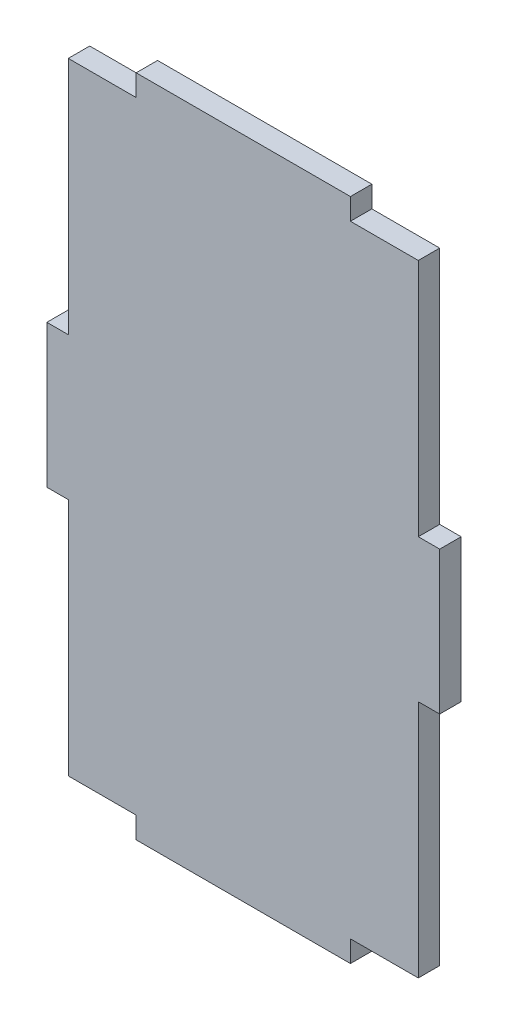
ISO-10303-21;
HEADER;
FILE_DESCRIPTION(('STEP AP214'),'2;1');
FILE_NAME('part.step','',(''),(''),'','','');
FILE_SCHEMA(('AUTOMOTIVE_DESIGN { 1 0 10303 214 1 1 1 1 }'));
ENDSEC;
DATA;
#1=APPLICATION_CONTEXT('core data for automotive mechanical design processes');
#2=APPLICATION_PROTOCOL_DEFINITION('international standard','automotive_design',2000,#1);
#3=PRODUCT_CONTEXT('',#1,'mechanical');
#4=PRODUCT('Part','Part','',(#3));
#5=PRODUCT_RELATED_PRODUCT_CATEGORY('part','',(#4));
#6=PRODUCT_DEFINITION_FORMATION('','',#4);
#7=PRODUCT_DEFINITION_CONTEXT('part definition',#1,'design');
#8=PRODUCT_DEFINITION('design','',#6,#7);
#9=PRODUCT_DEFINITION_SHAPE('','',#8);
#10=(LENGTH_UNIT() NAMED_UNIT(*) SI_UNIT(.MILLI.,.METRE.));
#11=(NAMED_UNIT(*) PLANE_ANGLE_UNIT() SI_UNIT($,.RADIAN.));
#12=(NAMED_UNIT(*) SI_UNIT($,.STERADIAN.) SOLID_ANGLE_UNIT());
#13=UNCERTAINTY_MEASURE_WITH_UNIT(LENGTH_MEASURE(1.E-05),#10,'distance_accuracy_value','');
#14=(GEOMETRIC_REPRESENTATION_CONTEXT(3) GLOBAL_UNCERTAINTY_ASSIGNED_CONTEXT((#13)) GLOBAL_UNIT_ASSIGNED_CONTEXT((#10,
#11,#12)) REPRESENTATION_CONTEXT('',''));
#15=CARTESIAN_POINT('',(0.,0.,0.));
#16=DIRECTION('',(0.,0.,1.));
#17=DIRECTION('',(1.,0.,0.));
#18=AXIS2_PLACEMENT_3D('',#15,#16,#17);
#19=CARTESIAN_POINT('',(27.5,46.5,3.));
#20=DIRECTION('',(-1.,0.,0.));
#21=DIRECTION('',(0.,-1.,0.));
#22=AXIS2_PLACEMENT_3D('',#19,#20,#21);
#23=PLANE('',#22);
#24=DIRECTION('',(0.,1.,0.));
#25=VECTOR('',#24,1.);
#26=CARTESIAN_POINT('',(27.5,46.5,0.));
#27=LINE('',#26,#25);
#28=CARTESIAN_POINT('',(27.5,-10.,0.));
#29=VERTEX_POINT('',#28);
#30=CARTESIAN_POINT('',(27.5,10.,0.));
#31=VERTEX_POINT('',#30);
#32=EDGE_CURVE('E208',#29,#31,#27,.T.);
#33=ORIENTED_EDGE('',*,*,#32,.T.);
#34=DIRECTION('',(0.,0.,1.));
#35=VECTOR('',#34,1.);
#36=CARTESIAN_POINT('',(27.5,10.,0.));
#37=LINE('',#36,#35);
#38=CARTESIAN_POINT('',(27.5,10.,3.));
#39=VERTEX_POINT('',#38);
#40=EDGE_CURVE('E261',#31,#39,#37,.T.);
#41=ORIENTED_EDGE('',*,*,#40,.T.);
#42=DIRECTION('',(0.,1.,0.));
#43=VECTOR('',#42,1.);
#44=CARTESIAN_POINT('',(27.5,46.5,3.));
#45=LINE('',#44,#43);
#46=CARTESIAN_POINT('',(27.5,-10.,3.));
#47=VERTEX_POINT('',#46);
#48=EDGE_CURVE('E196',#47,#39,#45,.T.);
#49=ORIENTED_EDGE('',*,*,#48,.F.);
#50=DIRECTION('',(0.,0.,1.));
#51=VECTOR('',#50,1.);
#52=CARTESIAN_POINT('',(27.5,-10.,0.));
#53=LINE('',#52,#51);
#54=EDGE_CURVE('E284',#29,#47,#53,.T.);
#55=ORIENTED_EDGE('',*,*,#54,.F.);
#56=EDGE_LOOP('',(#33,#41,#49,#55));
#57=FACE_BOUND('',#56,.T.);
#58=ADVANCED_FACE('F32',(#57),#23,.F.);
#59=CARTESIAN_POINT('',(-27.5,46.5,3.));
#60=DIRECTION('',(0.,-1.,0.));
#61=DIRECTION('',(0.,0.,-1.));
#62=AXIS2_PLACEMENT_3D('',#59,#60,#61);
#63=PLANE('',#62);
#64=DIRECTION('',(-1.,0.,0.));
#65=VECTOR('',#64,1.);
#66=CARTESIAN_POINT('',(-27.5,46.5,3.));
#67=LINE('',#66,#65);
#68=CARTESIAN_POINT('',(15.,46.5,3.));
#69=VERTEX_POINT('',#68);
#70=CARTESIAN_POINT('',(-15.,46.5,3.));
#71=VERTEX_POINT('',#70);
#72=EDGE_CURVE('E199',#69,#71,#67,.T.);
#73=ORIENTED_EDGE('',*,*,#72,.F.);
#74=DIRECTION('',(0.,0.,1.));
#75=VECTOR('',#74,1.);
#76=CARTESIAN_POINT('',(15.,46.5,0.));
#77=LINE('',#76,#75);
#78=CARTESIAN_POINT('',(15.,46.5,0.));
#79=VERTEX_POINT('',#78);
#80=EDGE_CURVE('E252',#79,#69,#77,.T.);
#81=ORIENTED_EDGE('',*,*,#80,.F.);
#82=DIRECTION('',(-1.,0.,0.));
#83=VECTOR('',#82,1.);
#84=CARTESIAN_POINT('',(-27.5,46.5,0.));
#85=LINE('',#84,#83);
#86=CARTESIAN_POINT('',(-15.,46.5,0.));
#87=VERTEX_POINT('',#86);
#88=EDGE_CURVE('E202',#79,#87,#85,.T.);
#89=ORIENTED_EDGE('',*,*,#88,.T.);
#90=DIRECTION('',(0.,0.,1.));
#91=VECTOR('',#90,1.);
#92=CARTESIAN_POINT('',(-15.,46.5,0.));
#93=LINE('',#92,#91);
#94=EDGE_CURVE('E212',#87,#71,#93,.T.);
#95=ORIENTED_EDGE('',*,*,#94,.T.);
#96=EDGE_LOOP('',(#73,#81,#89,#95));
#97=FACE_BOUND('',#96,.T.);
#98=ADVANCED_FACE('F365',(#97),#63,.F.);
#99=CARTESIAN_POINT('',(-27.5,46.5,3.));
#100=DIRECTION('',(1.,0.,0.));
#101=DIRECTION('',(0.,1.,0.));
#102=AXIS2_PLACEMENT_3D('',#99,#100,#101);
#103=PLANE('',#102);
#104=DIRECTION('',(0.,-1.,0.));
#105=VECTOR('',#104,1.);
#106=CARTESIAN_POINT('',(-27.5,46.5,0.));
#107=LINE('',#106,#105);
#108=CARTESIAN_POINT('',(-27.5,10.,0.));
#109=VERTEX_POINT('',#108);
#110=CARTESIAN_POINT('',(-27.5,-10.,0.));
#111=VERTEX_POINT('',#110);
#112=EDGE_CURVE('E197',#109,#111,#107,.T.);
#113=ORIENTED_EDGE('',*,*,#112,.T.);
#114=DIRECTION('',(0.,0.,1.));
#115=VECTOR('',#114,1.);
#116=CARTESIAN_POINT('',(-27.5,-10.,0.));
#117=LINE('',#116,#115);
#118=CARTESIAN_POINT('',(-27.5,-10.,3.));
#119=VERTEX_POINT('',#118);
#120=EDGE_CURVE('E241',#111,#119,#117,.T.);
#121=ORIENTED_EDGE('',*,*,#120,.T.);
#122=DIRECTION('',(0.,-1.,0.));
#123=VECTOR('',#122,1.);
#124=CARTESIAN_POINT('',(-27.5,46.5,3.));
#125=LINE('',#124,#123);
#126=CARTESIAN_POINT('',(-27.5,10.,3.));
#127=VERTEX_POINT('',#126);
#128=EDGE_CURVE('E40',#127,#119,#125,.T.);
#129=ORIENTED_EDGE('',*,*,#128,.F.);
#130=DIRECTION('',(0.,0.,1.));
#131=VECTOR('',#130,1.);
#132=CARTESIAN_POINT('',(-27.5,10.,0.));
#133=LINE('',#132,#131);
#134=EDGE_CURVE('E218',#109,#127,#133,.T.);
#135=ORIENTED_EDGE('',*,*,#134,.F.);
#136=EDGE_LOOP('',(#113,#121,#129,#135));
#137=FACE_BOUND('',#136,.T.);
#138=ADVANCED_FACE('F347',(#137),#103,.F.);
#139=CARTESIAN_POINT('',(-27.5,-46.5,3.));
#140=DIRECTION('',(0.,1.,0.));
#141=DIRECTION('',(0.,0.,1.));
#142=AXIS2_PLACEMENT_3D('',#139,#140,#141);
#143=PLANE('',#142);
#144=DIRECTION('',(1.,0.,0.));
#145=VECTOR('',#144,1.);
#146=CARTESIAN_POINT('',(-27.5,-46.5,0.));
#147=LINE('',#146,#145);
#148=CARTESIAN_POINT('',(-15.,-46.5,0.));
#149=VERTEX_POINT('',#148);
#150=CARTESIAN_POINT('',(15.,-46.5,0.));
#151=VERTEX_POINT('',#150);
#152=EDGE_CURVE('E35',#149,#151,#147,.T.);
#153=ORIENTED_EDGE('',*,*,#152,.T.);
#154=DIRECTION('',(0.,0.,1.));
#155=VECTOR('',#154,1.);
#156=CARTESIAN_POINT('',(15.,-46.5,0.));
#157=LINE('',#156,#155);
#158=CARTESIAN_POINT('',(15.,-46.5,3.));
#159=VERTEX_POINT('',#158);
#160=EDGE_CURVE('E292',#151,#159,#157,.T.);
#161=ORIENTED_EDGE('',*,*,#160,.T.);
#162=DIRECTION('',(1.,0.,0.));
#163=VECTOR('',#162,1.);
#164=CARTESIAN_POINT('',(-27.5,-46.5,3.));
#165=LINE('',#164,#163);
#166=CARTESIAN_POINT('',(-15.,-46.5,3.));
#167=VERTEX_POINT('',#166);
#168=EDGE_CURVE('E11',#167,#159,#165,.T.);
#169=ORIENTED_EDGE('',*,*,#168,.F.);
#170=DIRECTION('',(0.,0.,1.));
#171=VECTOR('',#170,1.);
#172=CARTESIAN_POINT('',(-15.,-46.5,0.));
#173=LINE('',#172,#171);
#174=EDGE_CURVE('E174',#149,#167,#173,.T.);
#175=ORIENTED_EDGE('',*,*,#174,.F.);
#176=EDGE_LOOP('',(#153,#161,#169,#175));
#177=FACE_BOUND('',#176,.T.);
#178=ADVANCED_FACE('F186',(#177),#143,.F.);
#179=CARTESIAN_POINT('',(0.,0.,3.));
#180=DIRECTION('',(0.,0.,1.));
#181=DIRECTION('',(1.,0.,0.));
#182=AXIS2_PLACEMENT_3D('',#179,#180,#181);
#183=PLANE('',#182);
#184=DIRECTION('',(1.,0.,0.));
#185=VECTOR('',#184,1.);
#186=CARTESIAN_POINT('',(27.5,10.,3.));
#187=LINE('',#186,#185);
#188=CARTESIAN_POINT('',(24.5,10.,3.));
#189=VERTEX_POINT('',#188);
#190=EDGE_CURVE('E265',#189,#39,#187,.T.);
#191=ORIENTED_EDGE('',*,*,#190,.F.);
#192=DIRECTION('',(0.,-1.,0.));
#193=VECTOR('',#192,1.);
#194=CARTESIAN_POINT('',(24.5,43.5,3.));
#195=LINE('',#194,#193);
#196=CARTESIAN_POINT('',(24.5,43.5,3.));
#197=VERTEX_POINT('',#196);
#198=EDGE_CURVE('E268',#197,#189,#195,.T.);
#199=ORIENTED_EDGE('',*,*,#198,.F.);
#200=DIRECTION('',(1.,0.,0.));
#201=VECTOR('',#200,1.);
#202=CARTESIAN_POINT('',(24.5,43.5,3.));
#203=LINE('',#202,#201);
#204=CARTESIAN_POINT('',(15.,43.5,3.));
#205=VERTEX_POINT('',#204);
#206=EDGE_CURVE('E271',#205,#197,#203,.T.);
#207=ORIENTED_EDGE('',*,*,#206,.F.);
#208=DIRECTION('',(0.,-1.,0.));
#209=VECTOR('',#208,1.);
#210=CARTESIAN_POINT('',(15.,46.5,3.));
#211=LINE('',#210,#209);
#212=EDGE_CURVE('E274',#69,#205,#211,.T.);
#213=ORIENTED_EDGE('',*,*,#212,.F.);
#214=ORIENTED_EDGE('',*,*,#72,.T.);
#215=DIRECTION('',(0.,1.,0.));
#216=VECTOR('',#215,1.);
#217=CARTESIAN_POINT('',(-15.,46.5,3.));
#218=LINE('',#217,#216);
#219=CARTESIAN_POINT('',(-15.,43.5,3.));
#220=VERTEX_POINT('',#219);
#221=EDGE_CURVE('E229',#220,#71,#218,.T.);
#222=ORIENTED_EDGE('',*,*,#221,.F.);
#223=DIRECTION('',(1.,0.,0.));
#224=VECTOR('',#223,1.);
#225=CARTESIAN_POINT('',(-24.5,43.5,3.));
#226=LINE('',#225,#224);
#227=CARTESIAN_POINT('',(-24.5,43.5,3.));
#228=VERTEX_POINT('',#227);
#229=EDGE_CURVE('E232',#228,#220,#226,.T.);
#230=ORIENTED_EDGE('',*,*,#229,.F.);
#231=DIRECTION('',(0.,1.,0.));
#232=VECTOR('',#231,1.);
#233=CARTESIAN_POINT('',(-24.5,43.5,3.));
#234=LINE('',#233,#232);
#235=CARTESIAN_POINT('',(-24.5,10.,3.));
#236=VERTEX_POINT('',#235);
#237=EDGE_CURVE('E235',#236,#228,#234,.T.);
#238=ORIENTED_EDGE('',*,*,#237,.F.);
#239=DIRECTION('',(1.,0.,0.));
#240=VECTOR('',#239,1.);
#241=CARTESIAN_POINT('',(-27.5,10.,3.));
#242=LINE('',#241,#240);
#243=EDGE_CURVE('E238',#127,#236,#242,.T.);
#244=ORIENTED_EDGE('',*,*,#243,.F.);
#245=ORIENTED_EDGE('',*,*,#128,.T.);
#246=DIRECTION('',(-1.,0.,0.));
#247=VECTOR('',#246,1.);
#248=CARTESIAN_POINT('',(-27.5,-10.,3.));
#249=LINE('',#248,#247);
#250=CARTESIAN_POINT('',(-24.5,-10.,3.));
#251=VERTEX_POINT('',#250);
#252=EDGE_CURVE('E181',#251,#119,#249,.T.);
#253=ORIENTED_EDGE('',*,*,#252,.F.);
#254=DIRECTION('',(0.,1.,0.));
#255=VECTOR('',#254,1.);
#256=CARTESIAN_POINT('',(-24.5,-43.5,3.));
#257=LINE('',#256,#255);
#258=CARTESIAN_POINT('',(-24.5,-43.5,3.));
#259=VERTEX_POINT('',#258);
#260=EDGE_CURVE('E319',#259,#251,#257,.T.);
#261=ORIENTED_EDGE('',*,*,#260,.F.);
#262=DIRECTION('',(-1.,0.,0.));
#263=VECTOR('',#262,1.);
#264=CARTESIAN_POINT('',(-24.5,-43.5,3.));
#265=LINE('',#264,#263);
#266=CARTESIAN_POINT('',(-15.,-43.5,3.));
#267=VERTEX_POINT('',#266);
#268=EDGE_CURVE('E322',#267,#259,#265,.T.);
#269=ORIENTED_EDGE('',*,*,#268,.F.);
#270=DIRECTION('',(0.,1.,0.));
#271=VECTOR('',#270,1.);
#272=CARTESIAN_POINT('',(-15.,-46.5,3.));
#273=LINE('',#272,#271);
#274=EDGE_CURVE('E294',#167,#267,#273,.T.);
#275=ORIENTED_EDGE('',*,*,#274,.F.);
#276=ORIENTED_EDGE('',*,*,#168,.T.);
#277=DIRECTION('',(0.,-1.,0.));
#278=VECTOR('',#277,1.);
#279=CARTESIAN_POINT('',(15.,-46.5,3.));
#280=LINE('',#279,#278);
#281=CARTESIAN_POINT('',(15.,-43.5,3.));
#282=VERTEX_POINT('',#281);
#283=EDGE_CURVE('E295',#282,#159,#280,.T.);
#284=ORIENTED_EDGE('',*,*,#283,.F.);
#285=DIRECTION('',(-1.,0.,0.));
#286=VECTOR('',#285,1.);
#287=CARTESIAN_POINT('',(24.5,-43.5,3.));
#288=LINE('',#287,#286);
#289=CARTESIAN_POINT('',(24.5,-43.5,3.));
#290=VERTEX_POINT('',#289);
#291=EDGE_CURVE('E298',#290,#282,#288,.T.);
#292=ORIENTED_EDGE('',*,*,#291,.F.);
#293=DIRECTION('',(0.,-1.,0.));
#294=VECTOR('',#293,1.);
#295=CARTESIAN_POINT('',(24.5,-43.5,3.));
#296=LINE('',#295,#294);
#297=CARTESIAN_POINT('',(24.5,-10.,3.));
#298=VERTEX_POINT('',#297);
#299=EDGE_CURVE('E301',#298,#290,#296,.T.);
#300=ORIENTED_EDGE('',*,*,#299,.F.);
#301=DIRECTION('',(-1.,0.,0.));
#302=VECTOR('',#301,1.);
#303=CARTESIAN_POINT('',(27.5,-10.,3.));
#304=LINE('',#303,#302);
#305=EDGE_CURVE('E264',#47,#298,#304,.T.);
#306=ORIENTED_EDGE('',*,*,#305,.F.);
#307=ORIENTED_EDGE('',*,*,#48,.T.);
#308=EDGE_LOOP('',(#191,#199,#207,#213,#214,#222,#230,#238,#244,#245,#253,#261,#269,#275,#276,
#284,#292,#300,#306,#307));
#309=FACE_BOUND('',#308,.T.);
#310=ADVANCED_FACE('F350',(#309),#183,.T.);
#311=CARTESIAN_POINT('',(0.,0.,0.));
#312=DIRECTION('',(0.,0.,1.));
#313=DIRECTION('',(1.,0.,0.));
#314=AXIS2_PLACEMENT_3D('',#311,#312,#313);
#315=PLANE('',#314);
#316=DIRECTION('',(0.,-1.,0.));
#317=VECTOR('',#316,1.);
#318=CARTESIAN_POINT('',(24.5,43.5,0.));
#319=LINE('',#318,#317);
#320=CARTESIAN_POINT('',(24.5,43.5,0.));
#321=VERTEX_POINT('',#320);
#322=CARTESIAN_POINT('',(24.5,10.,0.));
#323=VERTEX_POINT('',#322);
#324=EDGE_CURVE('E279',#321,#323,#319,.T.);
#325=ORIENTED_EDGE('',*,*,#324,.T.);
#326=DIRECTION('',(1.,0.,0.));
#327=VECTOR('',#326,1.);
#328=CARTESIAN_POINT('',(27.5,10.,0.));
#329=LINE('',#328,#327);
#330=EDGE_CURVE('E255',#323,#31,#329,.T.);
#331=ORIENTED_EDGE('',*,*,#330,.T.);
#332=ORIENTED_EDGE('',*,*,#32,.F.);
#333=DIRECTION('',(-1.,0.,0.));
#334=VECTOR('',#333,1.);
#335=CARTESIAN_POINT('',(27.5,-10.,0.));
#336=LINE('',#335,#334);
#337=CARTESIAN_POINT('',(24.5,-10.,0.));
#338=VERTEX_POINT('',#337);
#339=EDGE_CURVE('E297',#29,#338,#336,.T.);
#340=ORIENTED_EDGE('',*,*,#339,.T.);
#341=DIRECTION('',(0.,-1.,0.));
#342=VECTOR('',#341,1.);
#343=CARTESIAN_POINT('',(24.5,-43.5,0.));
#344=LINE('',#343,#342);
#345=CARTESIAN_POINT('',(24.5,-43.5,0.));
#346=VERTEX_POINT('',#345);
#347=EDGE_CURVE('E56',#338,#346,#344,.T.);
#348=ORIENTED_EDGE('',*,*,#347,.T.);
#349=DIRECTION('',(-1.,0.,0.));
#350=VECTOR('',#349,1.);
#351=CARTESIAN_POINT('',(24.5,-43.5,0.));
#352=LINE('',#351,#350);
#353=CARTESIAN_POINT('',(15.,-43.5,0.));
#354=VERTEX_POINT('',#353);
#355=EDGE_CURVE('E307',#346,#354,#352,.T.);
#356=ORIENTED_EDGE('',*,*,#355,.T.);
#357=DIRECTION('',(0.,-1.,0.));
#358=VECTOR('',#357,1.);
#359=CARTESIAN_POINT('',(15.,-46.5,0.));
#360=LINE('',#359,#358);
#361=EDGE_CURVE('E195',#354,#151,#360,.T.);
#362=ORIENTED_EDGE('',*,*,#361,.T.);
#363=ORIENTED_EDGE('',*,*,#152,.F.);
#364=DIRECTION('',(0.,1.,0.));
#365=VECTOR('',#364,1.);
#366=CARTESIAN_POINT('',(-15.,-46.5,0.));
#367=LINE('',#366,#365);
#368=CARTESIAN_POINT('',(-15.,-43.5,0.));
#369=VERTEX_POINT('',#368);
#370=EDGE_CURVE('E170',#149,#369,#367,.T.);
#371=ORIENTED_EDGE('',*,*,#370,.T.);
#372=DIRECTION('',(-1.,0.,0.));
#373=VECTOR('',#372,1.);
#374=CARTESIAN_POINT('',(-24.5,-43.5,0.));
#375=LINE('',#374,#373);
#376=CARTESIAN_POINT('',(-24.5,-43.5,0.));
#377=VERTEX_POINT('',#376);
#378=EDGE_CURVE('E180',#369,#377,#375,.T.);
#379=ORIENTED_EDGE('',*,*,#378,.T.);
#380=DIRECTION('',(0.,1.,0.));
#381=VECTOR('',#380,1.);
#382=CARTESIAN_POINT('',(-24.5,-43.5,0.));
#383=LINE('',#382,#381);
#384=CARTESIAN_POINT('',(-24.5,-10.,0.));
#385=VERTEX_POINT('',#384);
#386=EDGE_CURVE('E328',#377,#385,#383,.T.);
#387=ORIENTED_EDGE('',*,*,#386,.T.);
#388=DIRECTION('',(-1.,0.,0.));
#389=VECTOR('',#388,1.);
#390=CARTESIAN_POINT('',(-27.5,-10.,0.));
#391=LINE('',#390,#389);
#392=EDGE_CURVE('E188',#385,#111,#391,.T.);
#393=ORIENTED_EDGE('',*,*,#392,.T.);
#394=ORIENTED_EDGE('',*,*,#112,.F.);
#395=DIRECTION('',(1.,0.,0.));
#396=VECTOR('',#395,1.);
#397=CARTESIAN_POINT('',(-27.5,10.,0.));
#398=LINE('',#397,#396);
#399=CARTESIAN_POINT('',(-24.5,10.,0.));
#400=VERTEX_POINT('',#399);
#401=EDGE_CURVE('E231',#109,#400,#398,.T.);
#402=ORIENTED_EDGE('',*,*,#401,.T.);
#403=DIRECTION('',(0.,1.,0.));
#404=VECTOR('',#403,1.);
#405=CARTESIAN_POINT('',(-24.5,43.5,0.));
#406=LINE('',#405,#404);
#407=CARTESIAN_POINT('',(-24.5,43.5,0.));
#408=VERTEX_POINT('',#407);
#409=EDGE_CURVE('E247',#400,#408,#406,.T.);
#410=ORIENTED_EDGE('',*,*,#409,.T.);
#411=DIRECTION('',(1.,0.,0.));
#412=VECTOR('',#411,1.);
#413=CARTESIAN_POINT('',(-24.5,43.5,0.));
#414=LINE('',#413,#412);
#415=CARTESIAN_POINT('',(-15.,43.5,0.));
#416=VERTEX_POINT('',#415);
#417=EDGE_CURVE('E244',#408,#416,#414,.T.);
#418=ORIENTED_EDGE('',*,*,#417,.T.);
#419=DIRECTION('',(0.,1.,0.));
#420=VECTOR('',#419,1.);
#421=CARTESIAN_POINT('',(-15.,46.5,0.));
#422=LINE('',#421,#420);
#423=EDGE_CURVE('E221',#416,#87,#422,.T.);
#424=ORIENTED_EDGE('',*,*,#423,.T.);
#425=ORIENTED_EDGE('',*,*,#88,.F.);
#426=DIRECTION('',(0.,-1.,0.));
#427=VECTOR('',#426,1.);
#428=CARTESIAN_POINT('',(15.,46.5,0.));
#429=LINE('',#428,#427);
#430=CARTESIAN_POINT('',(15.,43.5,0.));
#431=VERTEX_POINT('',#430);
#432=EDGE_CURVE('E267',#79,#431,#429,.T.);
#433=ORIENTED_EDGE('',*,*,#432,.T.);
#434=DIRECTION('',(1.,0.,0.));
#435=VECTOR('',#434,1.);
#436=CARTESIAN_POINT('',(24.5,43.5,0.));
#437=LINE('',#436,#435);
#438=EDGE_CURVE('E48',#431,#321,#437,.T.);
#439=ORIENTED_EDGE('',*,*,#438,.T.);
#440=EDGE_LOOP('',(#325,#331,#332,#340,#348,#356,#362,#363,#371,#379,#387,#393,#394,#402,#410,
#418,#424,#425,#433,#439));
#441=FACE_BOUND('',#440,.T.);
#442=ADVANCED_FACE('F192',(#441),#315,.F.);
#443=CARTESIAN_POINT('',(-15.,46.5,0.));
#444=DIRECTION('',(1.,0.,0.));
#445=DIRECTION('',(0.,0.,-1.));
#446=AXIS2_PLACEMENT_3D('',#443,#444,#445);
#447=PLANE('',#446);
#448=ORIENTED_EDGE('',*,*,#221,.T.);
#449=ORIENTED_EDGE('',*,*,#94,.F.);
#450=ORIENTED_EDGE('',*,*,#423,.F.);
#451=DIRECTION('',(0.,0.,1.));
#452=VECTOR('',#451,1.);
#453=CARTESIAN_POINT('',(-15.,43.5,0.));
#454=LINE('',#453,#452);
#455=EDGE_CURVE('E225',#416,#220,#454,.T.);
#456=ORIENTED_EDGE('',*,*,#455,.T.);
#457=EDGE_LOOP('',(#448,#449,#450,#456));
#458=FACE_BOUND('',#457,.T.);
#459=ADVANCED_FACE('F415',(#458),#447,.F.);
#460=CARTESIAN_POINT('',(-24.5,43.5,0.));
#461=DIRECTION('',(0.,-1.,0.));
#462=DIRECTION('',(0.,0.,-1.));
#463=AXIS2_PLACEMENT_3D('',#460,#461,#462);
#464=PLANE('',#463);
#465=ORIENTED_EDGE('',*,*,#229,.T.);
#466=ORIENTED_EDGE('',*,*,#455,.F.);
#467=ORIENTED_EDGE('',*,*,#417,.F.);
#468=DIRECTION('',(0.,0.,1.));
#469=VECTOR('',#468,1.);
#470=CARTESIAN_POINT('',(-24.5,43.5,0.));
#471=LINE('',#470,#469);
#472=EDGE_CURVE('E223',#408,#228,#471,.T.);
#473=ORIENTED_EDGE('',*,*,#472,.T.);
#474=EDGE_LOOP('',(#465,#466,#467,#473));
#475=FACE_BOUND('',#474,.T.);
#476=ADVANCED_FACE('F358',(#475),#464,.F.);
#477=CARTESIAN_POINT('',(-24.5,43.5,0.));
#478=DIRECTION('',(1.,0.,0.));
#479=DIRECTION('',(0.,1.,0.));
#480=AXIS2_PLACEMENT_3D('',#477,#478,#479);
#481=PLANE('',#480);
#482=ORIENTED_EDGE('',*,*,#237,.T.);
#483=ORIENTED_EDGE('',*,*,#472,.F.);
#484=ORIENTED_EDGE('',*,*,#409,.F.);
#485=DIRECTION('',(0.,0.,1.));
#486=VECTOR('',#485,1.);
#487=CARTESIAN_POINT('',(-24.5,10.,0.));
#488=LINE('',#487,#486);
#489=EDGE_CURVE('E220',#400,#236,#488,.T.);
#490=ORIENTED_EDGE('',*,*,#489,.T.);
#491=EDGE_LOOP('',(#482,#483,#484,#490));
#492=FACE_BOUND('',#491,.T.);
#493=ADVANCED_FACE('F355',(#492),#481,.F.);
#494=CARTESIAN_POINT('',(-27.5,10.,0.));
#495=DIRECTION('',(0.,-1.,0.));
#496=DIRECTION('',(0.,0.,-1.));
#497=AXIS2_PLACEMENT_3D('',#494,#495,#496);
#498=PLANE('',#497);
#499=ORIENTED_EDGE('',*,*,#243,.T.);
#500=ORIENTED_EDGE('',*,*,#489,.F.);
#501=ORIENTED_EDGE('',*,*,#401,.F.);
#502=ORIENTED_EDGE('',*,*,#134,.T.);
#503=EDGE_LOOP('',(#499,#500,#501,#502));
#504=FACE_BOUND('',#503,.T.);
#505=ADVANCED_FACE('F344',(#504),#498,.F.);
#506=CARTESIAN_POINT('',(-27.5,-10.,0.));
#507=DIRECTION('',(0.,1.,0.));
#508=DIRECTION('',(0.,0.,1.));
#509=AXIS2_PLACEMENT_3D('',#506,#507,#508);
#510=PLANE('',#509);
#511=ORIENTED_EDGE('',*,*,#252,.T.);
#512=ORIENTED_EDGE('',*,*,#120,.F.);
#513=ORIENTED_EDGE('',*,*,#392,.F.);
#514=DIRECTION('',(0.,0.,1.));
#515=VECTOR('',#514,1.);
#516=CARTESIAN_POINT('',(-24.5,-10.,0.));
#517=LINE('',#516,#515);
#518=EDGE_CURVE('E315',#385,#251,#517,.T.);
#519=ORIENTED_EDGE('',*,*,#518,.T.);
#520=EDGE_LOOP('',(#511,#512,#513,#519));
#521=FACE_BOUND('',#520,.T.);
#522=ADVANCED_FACE('F341',(#521),#510,.F.);
#523=CARTESIAN_POINT('',(-24.5,-43.5,0.));
#524=DIRECTION('',(1.,0.,0.));
#525=DIRECTION('',(0.,1.,0.));
#526=AXIS2_PLACEMENT_3D('',#523,#524,#525);
#527=PLANE('',#526);
#528=ORIENTED_EDGE('',*,*,#260,.T.);
#529=ORIENTED_EDGE('',*,*,#518,.F.);
#530=ORIENTED_EDGE('',*,*,#386,.F.);
#531=DIRECTION('',(0.,0.,1.));
#532=VECTOR('',#531,1.);
#533=CARTESIAN_POINT('',(-24.5,-43.5,0.));
#534=LINE('',#533,#532);
#535=EDGE_CURVE('E313',#377,#259,#534,.T.);
#536=ORIENTED_EDGE('',*,*,#535,.T.);
#537=EDGE_LOOP('',(#528,#529,#530,#536));
#538=FACE_BOUND('',#537,.T.);
#539=ADVANCED_FACE('F337',(#538),#527,.F.);
#540=CARTESIAN_POINT('',(-24.5,-43.5,0.));
#541=DIRECTION('',(0.,1.,0.));
#542=DIRECTION('',(0.,0.,1.));
#543=AXIS2_PLACEMENT_3D('',#540,#541,#542);
#544=PLANE('',#543);
#545=ORIENTED_EDGE('',*,*,#268,.T.);
#546=ORIENTED_EDGE('',*,*,#535,.F.);
#547=ORIENTED_EDGE('',*,*,#378,.F.);
#548=DIRECTION('',(0.,0.,1.));
#549=VECTOR('',#548,1.);
#550=CARTESIAN_POINT('',(-15.,-43.5,0.));
#551=LINE('',#550,#549);
#552=EDGE_CURVE('E176',#369,#267,#551,.T.);
#553=ORIENTED_EDGE('',*,*,#552,.T.);
#554=EDGE_LOOP('',(#545,#546,#547,#553));
#555=FACE_BOUND('',#554,.T.);
#556=ADVANCED_FACE('F333',(#555),#544,.F.);
#557=CARTESIAN_POINT('',(-15.,-46.5,0.));
#558=DIRECTION('',(1.,0.,0.));
#559=DIRECTION('',(0.,0.,-1.));
#560=AXIS2_PLACEMENT_3D('',#557,#558,#559);
#561=PLANE('',#560);
#562=ORIENTED_EDGE('',*,*,#274,.T.);
#563=ORIENTED_EDGE('',*,*,#552,.F.);
#564=ORIENTED_EDGE('',*,*,#370,.F.);
#565=ORIENTED_EDGE('',*,*,#174,.T.);
#566=EDGE_LOOP('',(#562,#563,#564,#565));
#567=FACE_BOUND('',#566,.T.);
#568=ADVANCED_FACE('F173',(#567),#561,.F.);
#569=CARTESIAN_POINT('',(15.,-46.5,0.));
#570=DIRECTION('',(-1.,0.,0.));
#571=DIRECTION('',(0.,0.,1.));
#572=AXIS2_PLACEMENT_3D('',#569,#570,#571);
#573=PLANE('',#572);
#574=ORIENTED_EDGE('',*,*,#283,.T.);
#575=ORIENTED_EDGE('',*,*,#160,.F.);
#576=ORIENTED_EDGE('',*,*,#361,.F.);
#577=DIRECTION('',(0.,0.,1.));
#578=VECTOR('',#577,1.);
#579=CARTESIAN_POINT('',(15.,-43.5,0.));
#580=LINE('',#579,#578);
#581=EDGE_CURVE('E290',#354,#282,#580,.T.);
#582=ORIENTED_EDGE('',*,*,#581,.T.);
#583=EDGE_LOOP('',(#574,#575,#576,#582));
#584=FACE_BOUND('',#583,.T.);
#585=ADVANCED_FACE('F392',(#584),#573,.F.);
#586=CARTESIAN_POINT('',(24.5,-43.5,0.));
#587=DIRECTION('',(0.,1.,0.));
#588=DIRECTION('',(0.,0.,1.));
#589=AXIS2_PLACEMENT_3D('',#586,#587,#588);
#590=PLANE('',#589);
#591=ORIENTED_EDGE('',*,*,#291,.T.);
#592=ORIENTED_EDGE('',*,*,#581,.F.);
#593=ORIENTED_EDGE('',*,*,#355,.F.);
#594=DIRECTION('',(0.,0.,1.));
#595=VECTOR('',#594,1.);
#596=CARTESIAN_POINT('',(24.5,-43.5,0.));
#597=LINE('',#596,#595);
#598=EDGE_CURVE('E288',#346,#290,#597,.T.);
#599=ORIENTED_EDGE('',*,*,#598,.T.);
#600=EDGE_LOOP('',(#591,#592,#593,#599));
#601=FACE_BOUND('',#600,.T.);
#602=ADVANCED_FACE('F389',(#601),#590,.F.);
#603=CARTESIAN_POINT('',(24.5,-43.5,0.));
#604=DIRECTION('',(-1.,0.,0.));
#605=DIRECTION('',(0.,0.,1.));
#606=AXIS2_PLACEMENT_3D('',#603,#604,#605);
#607=PLANE('',#606);
#608=ORIENTED_EDGE('',*,*,#299,.T.);
#609=ORIENTED_EDGE('',*,*,#598,.F.);
#610=ORIENTED_EDGE('',*,*,#347,.F.);
#611=DIRECTION('',(0.,0.,1.));
#612=VECTOR('',#611,1.);
#613=CARTESIAN_POINT('',(24.5,-10.,0.));
#614=LINE('',#613,#612);
#615=EDGE_CURVE('E286',#338,#298,#614,.T.);
#616=ORIENTED_EDGE('',*,*,#615,.T.);
#617=EDGE_LOOP('',(#608,#609,#610,#616));
#618=FACE_BOUND('',#617,.T.);
#619=ADVANCED_FACE('F399',(#618),#607,.F.);
#620=CARTESIAN_POINT('',(27.5,-10.,0.));
#621=DIRECTION('',(0.,1.,0.));
#622=DIRECTION('',(-1.,0.,0.));
#623=AXIS2_PLACEMENT_3D('',#620,#621,#622);
#624=PLANE('',#623);
#625=ORIENTED_EDGE('',*,*,#305,.T.);
#626=ORIENTED_EDGE('',*,*,#615,.F.);
#627=ORIENTED_EDGE('',*,*,#339,.F.);
#628=ORIENTED_EDGE('',*,*,#54,.T.);
#629=EDGE_LOOP('',(#625,#626,#627,#628));
#630=FACE_BOUND('',#629,.T.);
#631=ADVANCED_FACE('F386',(#630),#624,.F.);
#632=CARTESIAN_POINT('',(27.5,10.,0.));
#633=DIRECTION('',(0.,-1.,0.));
#634=DIRECTION('',(1.,0.,0.));
#635=AXIS2_PLACEMENT_3D('',#632,#633,#634);
#636=PLANE('',#635);
#637=ORIENTED_EDGE('',*,*,#190,.T.);
#638=ORIENTED_EDGE('',*,*,#40,.F.);
#639=ORIENTED_EDGE('',*,*,#330,.F.);
#640=DIRECTION('',(0.,0.,1.));
#641=VECTOR('',#640,1.);
#642=CARTESIAN_POINT('',(24.5,10.,0.));
#643=LINE('',#642,#641);
#644=EDGE_CURVE('E259',#323,#189,#643,.T.);
#645=ORIENTED_EDGE('',*,*,#644,.T.);
#646=EDGE_LOOP('',(#637,#638,#639,#645));
#647=FACE_BOUND('',#646,.T.);
#648=ADVANCED_FACE('F378',(#647),#636,.F.);
#649=CARTESIAN_POINT('',(24.5,43.5,0.));
#650=DIRECTION('',(-1.,0.,0.));
#651=DIRECTION('',(0.,0.,1.));
#652=AXIS2_PLACEMENT_3D('',#649,#650,#651);
#653=PLANE('',#652);
#654=ORIENTED_EDGE('',*,*,#198,.T.);
#655=ORIENTED_EDGE('',*,*,#644,.F.);
#656=ORIENTED_EDGE('',*,*,#324,.F.);
#657=DIRECTION('',(0.,0.,1.));
#658=VECTOR('',#657,1.);
#659=CARTESIAN_POINT('',(24.5,43.5,0.));
#660=LINE('',#659,#658);
#661=EDGE_CURVE('E257',#321,#197,#660,.T.);
#662=ORIENTED_EDGE('',*,*,#661,.T.);
#663=EDGE_LOOP('',(#654,#655,#656,#662));
#664=FACE_BOUND('',#663,.T.);
#665=ADVANCED_FACE('F376',(#664),#653,.F.);
#666=CARTESIAN_POINT('',(24.5,43.5,0.));
#667=DIRECTION('',(0.,-1.,0.));
#668=DIRECTION('',(0.,0.,-1.));
#669=AXIS2_PLACEMENT_3D('',#666,#667,#668);
#670=PLANE('',#669);
#671=ORIENTED_EDGE('',*,*,#206,.T.);
#672=ORIENTED_EDGE('',*,*,#661,.F.);
#673=ORIENTED_EDGE('',*,*,#438,.F.);
#674=DIRECTION('',(0.,0.,1.));
#675=VECTOR('',#674,1.);
#676=CARTESIAN_POINT('',(15.,43.5,0.));
#677=LINE('',#676,#675);
#678=EDGE_CURVE('E254',#431,#205,#677,.T.);
#679=ORIENTED_EDGE('',*,*,#678,.T.);
#680=EDGE_LOOP('',(#671,#672,#673,#679));
#681=FACE_BOUND('',#680,.T.);
#682=ADVANCED_FACE('F371',(#681),#670,.F.);
#683=CARTESIAN_POINT('',(15.,46.5,0.));
#684=DIRECTION('',(-1.,0.,0.));
#685=DIRECTION('',(0.,0.,1.));
#686=AXIS2_PLACEMENT_3D('',#683,#684,#685);
#687=PLANE('',#686);
#688=ORIENTED_EDGE('',*,*,#212,.T.);
#689=ORIENTED_EDGE('',*,*,#678,.F.);
#690=ORIENTED_EDGE('',*,*,#432,.F.);
#691=ORIENTED_EDGE('',*,*,#80,.T.);
#692=EDGE_LOOP('',(#688,#689,#690,#691));
#693=FACE_BOUND('',#692,.T.);
#694=ADVANCED_FACE('F368',(#693),#687,.F.);
#695=CLOSED_SHELL('',(#58,#98,#138,#178,#310,#442,#459,#476,#493,#505,#522,#539,#556,#568,#585,
#602,#619,#631,#648,#665,#682,#694));
#696=MANIFOLD_SOLID_BREP('B2',#695);
#697=ADVANCED_BREP_SHAPE_REPRESENTATION('',(#18,#696),#14);
#698=SHAPE_DEFINITION_REPRESENTATION(#9,#697);
ENDSEC;
END-ISO-10303-21;
